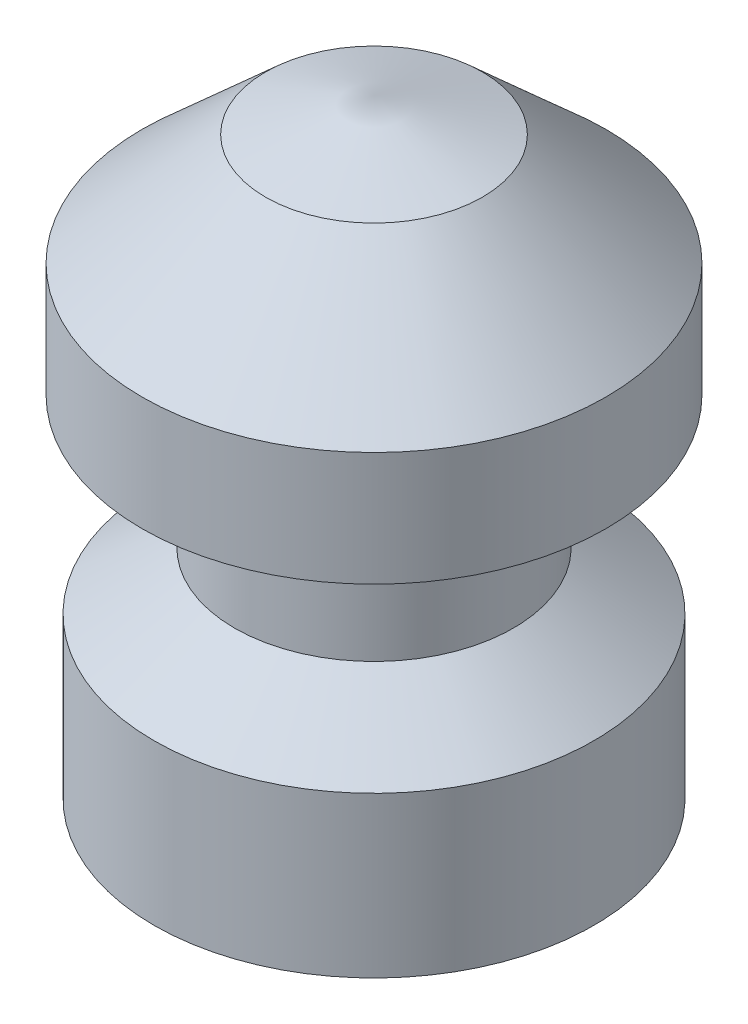
ISO-10303-21;
HEADER;
FILE_DESCRIPTION(('STEP AP214'),'2;1');
FILE_NAME('part.step','',(''),(''),'','','');
FILE_SCHEMA(('AUTOMOTIVE_DESIGN { 1 0 10303 214 1 1 1 1 }'));
ENDSEC;
DATA;
#1=APPLICATION_CONTEXT('core data for automotive mechanical design processes');
#2=APPLICATION_PROTOCOL_DEFINITION('international standard','automotive_design',2000,#1);
#3=PRODUCT_CONTEXT('',#1,'mechanical');
#4=PRODUCT('Part','Part','',(#3));
#5=PRODUCT_RELATED_PRODUCT_CATEGORY('part','',(#4));
#6=PRODUCT_DEFINITION_FORMATION('','',#4);
#7=PRODUCT_DEFINITION_CONTEXT('part definition',#1,'design');
#8=PRODUCT_DEFINITION('design','',#6,#7);
#9=PRODUCT_DEFINITION_SHAPE('','',#8);
#10=(LENGTH_UNIT() NAMED_UNIT(*) SI_UNIT(.MILLI.,.METRE.));
#11=(NAMED_UNIT(*) PLANE_ANGLE_UNIT() SI_UNIT($,.RADIAN.));
#12=(NAMED_UNIT(*) SI_UNIT($,.STERADIAN.) SOLID_ANGLE_UNIT());
#13=UNCERTAINTY_MEASURE_WITH_UNIT(LENGTH_MEASURE(1.E-05),#10,'distance_accuracy_value','');
#14=(GEOMETRIC_REPRESENTATION_CONTEXT(3) GLOBAL_UNCERTAINTY_ASSIGNED_CONTEXT((#13)) GLOBAL_UNIT_ASSIGNED_CONTEXT((#10,
#11,#12)) REPRESENTATION_CONTEXT('',''));
#15=CARTESIAN_POINT('',(0.,0.,0.));
#16=DIRECTION('',(0.,0.,1.));
#17=DIRECTION('',(1.,0.,0.));
#18=AXIS2_PLACEMENT_3D('',#15,#16,#17);
#19=CARTESIAN_POINT('',(0.,5.5767324745303,0.));
#20=DIRECTION('',(0.,-1.,0.));
#21=DIRECTION('',(0.,0.,-1.));
#22=AXIS2_PLACEMENT_3D('',#19,#20,#21);
#23=CONICAL_SURFACE('',#22,1.35637649353817,1.2683145952875);
#24=CARTESIAN_POINT('',(0.,6.,0.));
#25=VERTEX_POINT('',#24);
#26=VERTEX_LOOP('',#25);
#27=FACE_BOUND('',#26,.T.);
#28=CARTESIAN_POINT('',(0.,5.5767324745303,0.));
#29=DIRECTION('',(0.,1.,0.));
#30=DIRECTION('',(0.,0.,1.));
#31=AXIS2_PLACEMENT_3D('',#28,#29,#30);
#32=CIRCLE('',#31,1.35637649353817);
#33=CARTESIAN_POINT('',(0.,5.5767324745303,1.35637649353817));
#34=VERTEX_POINT('',#33);
#35=EDGE_CURVE('E11',#34,#34,#32,.T.);
#36=ORIENTED_EDGE('',*,*,#35,.T.);
#37=EDGE_LOOP('',(#36));
#38=FACE_BOUND('',#37,.T.);
#39=ADVANCED_FACE('F33',(#27,#38),#23,.T.);
#40=CARTESIAN_POINT('',(0.,4.18390392506716,0.));
#41=DIRECTION('',(0.,-1.,0.));
#42=DIRECTION('',(0.,0.,-1.));
#43=AXIS2_PLACEMENT_3D('',#40,#41,#42);
#44=CONICAL_SURFACE('',#43,2.9,0.836705867152997);
#45=ORIENTED_EDGE('',*,*,#35,.F.);
#46=EDGE_LOOP('',(#45));
#47=FACE_BOUND('',#46,.T.);
#48=CARTESIAN_POINT('',(0.,4.18390392506716,0.));
#49=DIRECTION('',(0.,1.,0.));
#50=DIRECTION('',(0.,0.,1.));
#51=AXIS2_PLACEMENT_3D('',#48,#49,#50);
#52=CIRCLE('',#51,2.9);
#53=CARTESIAN_POINT('',(0.,4.18390392506716,2.9));
#54=VERTEX_POINT('',#53);
#55=EDGE_CURVE('E39',#54,#54,#52,.T.);
#56=ORIENTED_EDGE('',*,*,#55,.T.);
#57=EDGE_LOOP('',(#56));
#58=FACE_BOUND('',#57,.T.);
#59=ADVANCED_FACE('F44',(#47,#58),#44,.T.);
#60=CARTESIAN_POINT('',(0.,6.,0.));
#61=DIRECTION('',(0.,1.,0.));
#62=DIRECTION('',(0.,0.,1.));
#63=AXIS2_PLACEMENT_3D('',#60,#61,#62);
#64=CYLINDRICAL_SURFACE('',#63,2.9);
#65=ORIENTED_EDGE('',*,*,#55,.F.);
#66=EDGE_LOOP('',(#65));
#67=FACE_BOUND('',#66,.T.);
#68=CARTESIAN_POINT('',(0.,2.75794675133396,0.));
#69=DIRECTION('',(0.,1.,0.));
#70=DIRECTION('',(0.,0.,1.));
#71=AXIS2_PLACEMENT_3D('',#68,#69,#70);
#72=CIRCLE('',#71,2.9);
#73=CARTESIAN_POINT('',(0.,2.75794675133396,2.9));
#74=VERTEX_POINT('',#73);
#75=EDGE_CURVE('E53',#74,#74,#72,.T.);
#76=ORIENTED_EDGE('',*,*,#75,.T.);
#77=EDGE_LOOP('',(#76));
#78=FACE_BOUND('',#77,.T.);
#79=ADVANCED_FACE('F49',(#67,#78),#64,.T.);
#80=CARTESIAN_POINT('',(0.,2.10298925147473,0.));
#81=DIRECTION('',(0.,1.,0.));
#82=DIRECTION('',(0.,0.,1.));
#83=AXIS2_PLACEMENT_3D('',#80,#81,#82);
#84=CONICAL_SURFACE('',#83,1.74337152487785,1.05555188243982);
#85=ORIENTED_EDGE('',*,*,#75,.F.);
#86=EDGE_LOOP('',(#85));
#87=FACE_BOUND('',#86,.T.);
#88=CARTESIAN_POINT('',(0.,2.10298925147473,0.));
#89=DIRECTION('',(0.,1.,0.));
#90=DIRECTION('',(0.,0.,1.));
#91=AXIS2_PLACEMENT_3D('',#88,#89,#90);
#92=CIRCLE('',#91,1.74337152487785);
#93=CARTESIAN_POINT('',(0.,2.10298925147473,1.74337152487785));
#94=VERTEX_POINT('',#93);
#95=EDGE_CURVE('E55',#94,#94,#92,.T.);
#96=ORIENTED_EDGE('',*,*,#95,.T.);
#97=EDGE_LOOP('',(#96));
#98=FACE_BOUND('',#97,.T.);
#99=ADVANCED_FACE('F102',(#87,#98),#84,.T.);
#100=CARTESIAN_POINT('',(0.,6.,0.));
#101=DIRECTION('',(0.,1.,0.));
#102=DIRECTION('',(0.,0.,1.));
#103=AXIS2_PLACEMENT_3D('',#100,#101,#102);
#104=CYLINDRICAL_SURFACE('',#103,1.74337152487785);
#105=ORIENTED_EDGE('',*,*,#95,.F.);
#106=EDGE_LOOP('',(#105));
#107=FACE_BOUND('',#106,.T.);
#108=CARTESIAN_POINT('',(0.,1.10298925147473,0.));
#109=DIRECTION('',(0.,1.,0.));
#110=DIRECTION('',(0.,0.,1.));
#111=AXIS2_PLACEMENT_3D('',#108,#109,#110);
#112=CIRCLE('',#111,1.74337152487785);
#113=CARTESIAN_POINT('',(0.,1.10298925147473,1.74337152487785));
#114=VERTEX_POINT('',#113);
#115=EDGE_CURVE('E60',#114,#114,#112,.T.);
#116=ORIENTED_EDGE('',*,*,#115,.T.);
#117=EDGE_LOOP('',(#116));
#118=FACE_BOUND('',#117,.T.);
#119=ADVANCED_FACE('F98',(#107,#118),#104,.T.);
#120=CARTESIAN_POINT('',(0.,0.387019832183904,0.));
#121=DIRECTION('',(0.,-1.,0.));
#122=DIRECTION('',(0.,0.,-1.));
#123=AXIS2_PLACEMENT_3D('',#120,#121,#122);
#124=CONICAL_SURFACE('',#123,2.75,0.952556620274344);
#125=ORIENTED_EDGE('',*,*,#115,.F.);
#126=EDGE_LOOP('',(#125));
#127=FACE_BOUND('',#126,.T.);
#128=CARTESIAN_POINT('',(0.,0.387019832183904,0.));
#129=DIRECTION('',(0.,1.,0.));
#130=DIRECTION('',(0.,0.,1.));
#131=AXIS2_PLACEMENT_3D('',#128,#129,#130);
#132=CIRCLE('',#131,2.75);
#133=CARTESIAN_POINT('',(0.,0.387019832183904,2.75));
#134=VERTEX_POINT('',#133);
#135=EDGE_CURVE('E63',#134,#134,#132,.T.);
#136=ORIENTED_EDGE('',*,*,#135,.T.);
#137=EDGE_LOOP('',(#136));
#138=FACE_BOUND('',#137,.T.);
#139=ADVANCED_FACE('F94',(#127,#138),#124,.T.);
#140=CARTESIAN_POINT('',(0.,6.,0.));
#141=DIRECTION('',(0.,1.,0.));
#142=DIRECTION('',(0.,0.,1.));
#143=AXIS2_PLACEMENT_3D('',#140,#141,#142);
#144=CYLINDRICAL_SURFACE('',#143,2.75);
#145=ORIENTED_EDGE('',*,*,#135,.F.);
#146=EDGE_LOOP('',(#145));
#147=FACE_BOUND('',#146,.T.);
#148=CARTESIAN_POINT('',(0.,-1.6129801678161,0.));
#149=DIRECTION('',(0.,1.,0.));
#150=DIRECTION('',(0.,0.,1.));
#151=AXIS2_PLACEMENT_3D('',#148,#149,#150);
#152=CIRCLE('',#151,2.75);
#153=CARTESIAN_POINT('',(0.,-1.6129801678161,2.75));
#154=VERTEX_POINT('',#153);
#155=EDGE_CURVE('E66',#154,#154,#152,.T.);
#156=ORIENTED_EDGE('',*,*,#155,.T.);
#157=EDGE_LOOP('',(#156));
#158=FACE_BOUND('',#157,.T.);
#159=ADVANCED_FACE('F90',(#147,#158),#144,.T.);
#160=CARTESIAN_POINT('',(0.,-1.6129801678161,-1.75));
#161=DIRECTION('',(0.,1.,0.));
#162=DIRECTION('',(0.,0.,1.));
#163=AXIS2_PLACEMENT_3D('',#160,#161,#162);
#164=PLANE('',#163);
#165=ORIENTED_EDGE('',*,*,#155,.F.);
#166=EDGE_LOOP('',(#165));
#167=FACE_BOUND('',#166,.T.);
#168=CARTESIAN_POINT('',(0.,-1.6129801678161,0.));
#169=DIRECTION('',(0.,1.,0.));
#170=DIRECTION('',(0.,0.,1.));
#171=AXIS2_PLACEMENT_3D('',#168,#169,#170);
#172=CIRCLE('',#171,1.75);
#173=CARTESIAN_POINT('',(0.,-1.6129801678161,-1.75));
#174=VERTEX_POINT('',#173);
#175=EDGE_CURVE('E69',#174,#174,#172,.T.);
#176=ORIENTED_EDGE('',*,*,#175,.T.);
#177=EDGE_LOOP('',(#176));
#178=FACE_BOUND('',#177,.T.);
#179=ADVANCED_FACE('F84',(#167,#178),#164,.F.);
#180=CARTESIAN_POINT('',(0.,0.,0.));
#181=DIRECTION('',(0.,-1.,0.));
#182=DIRECTION('',(0.,0.,-1.));
#183=AXIS2_PLACEMENT_3D('',#180,#181,#182);
#184=CONICAL_SURFACE('',#183,0.495725514791559,0.660940544726883);
#185=CARTESIAN_POINT('',(0.,0.,0.));
#186=DIRECTION('',(0.,1.,0.));
#187=DIRECTION('',(0.,0.,1.));
#188=AXIS2_PLACEMENT_3D('',#185,#186,#187);
#189=CIRCLE('',#188,0.495725514791559);
#190=CARTESIAN_POINT('',(0.,0.,-0.495725514791559));
#191=VERTEX_POINT('',#190);
#192=EDGE_CURVE('E72',#191,#191,#189,.T.);
#193=CARTESIAN_POINT('',(0.,-1.6129801678161,-1.75));
#194=CARTESIAN_POINT('',(0.,-1.59617829106801,-1.73693464077908));
#195=CARTESIAN_POINT('',(0.,-1.57937641431993,-1.72386928155816));
#196=CARTESIAN_POINT('',(0.,-1.54577266082376,-1.69773856311632));
#197=CARTESIAN_POINT('',(0.,-1.52897078407567,-1.68467320389539));
#198=CARTESIAN_POINT('',(0.,-1.49536703057951,-1.65854248545355));
#199=CARTESIAN_POINT('',(0.,-1.47856515383142,-1.64547712623263));
#200=CARTESIAN_POINT('',(0.,-1.44496140033525,-1.61934640779079));
#201=CARTESIAN_POINT('',(0.,-1.42815952358717,-1.60628104856987));
#202=CARTESIAN_POINT('',(0.,-1.394555770091,-1.58015033012802));
#203=CARTESIAN_POINT('',(0.,-1.37775389334292,-1.5670849709071));
#204=CARTESIAN_POINT('',(0.,-1.34415013984675,-1.54095425246526));
#205=CARTESIAN_POINT('',(0.,-1.32734826309866,-1.52788889324434));
#206=CARTESIAN_POINT('',(0.,-1.29374450960249,-1.5017581748025));
#207=CARTESIAN_POINT('',(0.,-1.27694263285441,-1.48869281558158));
#208=CARTESIAN_POINT('',(0.,-1.24333887935824,-1.46256209713973));
#209=CARTESIAN_POINT('',(0.,-1.22653700261016,-1.44949673791881));
#210=CARTESIAN_POINT('',(0.,-1.19293324911399,-1.42336601947697));
#211=CARTESIAN_POINT('',(0.,-1.1761313723659,-1.41030066025605));
#212=CARTESIAN_POINT('',(0.,-1.14252761886973,-1.38416994181421));
#213=CARTESIAN_POINT('',(0.,-1.12572574212165,-1.37110458259328));
#214=CARTESIAN_POINT('',(0.,-1.09212198862548,-1.34497386415144));
#215=CARTESIAN_POINT('',(0.,-1.0753201118774,-1.33190850493052));
#216=CARTESIAN_POINT('',(0.,-1.04171635838123,-1.30577778648868));
#217=CARTESIAN_POINT('',(0.,-1.02491448163314,-1.29271242726776));
#218=CARTESIAN_POINT('',(0.,-0.991310728136976,-1.26658170882591));
#219=CARTESIAN_POINT('',(0.,-0.974508851388891,-1.25351634960499));
#220=CARTESIAN_POINT('',(0.,-0.940905097892723,-1.22738563116315));
#221=CARTESIAN_POINT('',(0.,-0.924103221144638,-1.21432027194223));
#222=CARTESIAN_POINT('',(0.,-0.89049946764847,-1.18818955350039));
#223=CARTESIAN_POINT('',(0.,-0.873697590900385,-1.17512419427947));
#224=CARTESIAN_POINT('',(0.,-0.840093837404217,-1.14899347583762));
#225=CARTESIAN_POINT('',(0.,-0.823291960656132,-1.1359281166167));
#226=CARTESIAN_POINT('',(0.,-0.789688207159964,-1.10979739817486));
#227=CARTESIAN_POINT('',(0.,-0.772886330411879,-1.09673203895394));
#228=CARTESIAN_POINT('',(0.,-0.739282576915711,-1.07060132051209));
#229=CARTESIAN_POINT('',(0.,-0.722480700167626,-1.05753596129117));
#230=CARTESIAN_POINT('',(0.,-0.688876946671458,-1.03140524284933));
#231=CARTESIAN_POINT('',(0.,-0.672075069923373,-1.01833988362841));
#232=CARTESIAN_POINT('',(0.,-0.638471316427205,-0.992209165186567));
#233=CARTESIAN_POINT('',(0.,-0.62166943967912,-0.979143805965646));
#234=CARTESIAN_POINT('',(0.,-0.588065686182952,-0.953013087523803));
#235=CARTESIAN_POINT('',(0.,-0.571263809434867,-0.939947728302882));
#236=CARTESIAN_POINT('',(0.,-0.537660055938699,-0.91381700986104));
#237=CARTESIAN_POINT('',(0.,-0.520858179190614,-0.900751650640118));
#238=CARTESIAN_POINT('',(0.,-0.487254425694446,-0.874620932198276));
#239=CARTESIAN_POINT('',(0.,-0.470452548946361,-0.861555572977355));
#240=CARTESIAN_POINT('',(0.,-0.436848795450193,-0.835424854535512));
#241=CARTESIAN_POINT('',(0.,-0.420046918702108,-0.822359495314591));
#242=CARTESIAN_POINT('',(0.,-0.38644316520594,-0.796228776872748));
#243=CARTESIAN_POINT('',(0.,-0.369641288457855,-0.783163417651827));
#244=CARTESIAN_POINT('',(0.,-0.336037534961687,-0.757032699209984));
#245=CARTESIAN_POINT('',(0.,-0.319235658213602,-0.743967339989063));
#246=CARTESIAN_POINT('',(0.,-0.285631904717434,-0.717836621547221));
#247=CARTESIAN_POINT('',(0.,-0.268830027969349,-0.704771262326299));
#248=CARTESIAN_POINT('',(0.,-0.235226274473181,-0.678640543884457));
#249=CARTESIAN_POINT('',(0.,-0.218424397725096,-0.665575184663535));
#250=CARTESIAN_POINT('',(0.,-0.184820644228928,-0.639444466221693));
#251=CARTESIAN_POINT('',(0.,-0.168018767480843,-0.626379107000772));
#252=CARTESIAN_POINT('',(0.,-0.134415013984675,-0.600248388558929));
#253=CARTESIAN_POINT('',(0.,-0.11761313723659,-0.587183029338008));
#254=CARTESIAN_POINT('',(0.,-0.0840093837404216,-0.561052310896165));
#255=CARTESIAN_POINT('',(0.,-0.0672075069923373,-0.547986951675244));
#256=CARTESIAN_POINT('',(0.,-0.0336037534961686,-0.521856233233401));
#257=CARTESIAN_POINT('',(0.,-0.0168018767480843,-0.50879087401248));
#258=CARTESIAN_POINT('',(0.,0.,-0.495725514791559));
#259=B_SPLINE_CURVE_WITH_KNOTS('',3,(#193,#194,#195,#196,#197,#198,#199,#200,#201,#202,#203,
#204,#205,#206,#207,#208,#209,#210,#211,#212,#213,#214,#215,#216,#217,#218,#219,#220,#221,#222,
#223,#224,#225,#226,#227,#228,#229,#230,#231,#232,#233,#234,#235,#236,#237,#238,#239,#240,#241,
#242,#243,#244,#245,#246,#247,#248,#249,#250,#251,#252,#253,#254,#255,#256,#257,#258),
.UNSPECIFIED.,.F.,.F.,(4,2,2,2,2,2,2,2,2,2,2,2,2,2,2,2,2,2,2,2,2,2,2,2,2,2,2,2,2,2,2,2,4),(0.,
0.0638518603054426,0.127703720610885,0.191555580916328,0.255407441221771,0.319259301527213,
0.383111161832656,0.446963022138099,0.510814882443541,0.574666742748984,0.638518603054426,
0.702370463359869,0.766222323665312,0.830074183970754,0.893926044276197,0.95777790458164,
1.02162976488708,1.08548162519253,1.14933348549797,1.21318534580341,1.27703720610885,
1.3408890664143,1.40474092671974,1.46859278702518,1.53244464733062,1.59629650763607,
1.66014836794151,1.72400022824695,1.78785208855239,1.85170394885784,1.91555580916328,
1.97940766946872,2.04325952977416),.UNSPECIFIED.);
#260=EDGE_CURVE('BSEAM76',#174,#191,#259,.T.);
#261=ORIENTED_EDGE('',*,*,#175,.F.);
#262=ORIENTED_EDGE('',*,*,#192,.T.);
#263=ORIENTED_EDGE('',*,*,#260,.T.);
#264=ORIENTED_EDGE('',*,*,#260,.F.);
#265=EDGE_LOOP('',(#261,#263,#262,#264));
#266=FACE_BOUND('',#265,.T.);
#267=ADVANCED_FACE('F76',(#266),#184,.F.);
#268=CARTESIAN_POINT('',(0.,0.,0.));
#269=DIRECTION('',(0.,1.,0.));
#270=DIRECTION('',(0.,0.,1.));
#271=AXIS2_PLACEMENT_3D('',#268,#269,#270);
#272=PLANE('',#271);
#273=ORIENTED_EDGE('',*,*,#192,.F.);
#274=EDGE_LOOP('',(#273));
#275=FACE_BOUND('',#274,.T.);
#276=ADVANCED_FACE('F78',(#275),#272,.F.);
#277=CLOSED_SHELL('',(#39,#59,#79,#99,#119,#139,#159,#179,#267,#276));
#278=MANIFOLD_SOLID_BREP('B2',#277);
#279=ADVANCED_BREP_SHAPE_REPRESENTATION('',(#18,#278),#14);
#280=SHAPE_DEFINITION_REPRESENTATION(#9,#279);
ENDSEC;
END-ISO-10303-21;
